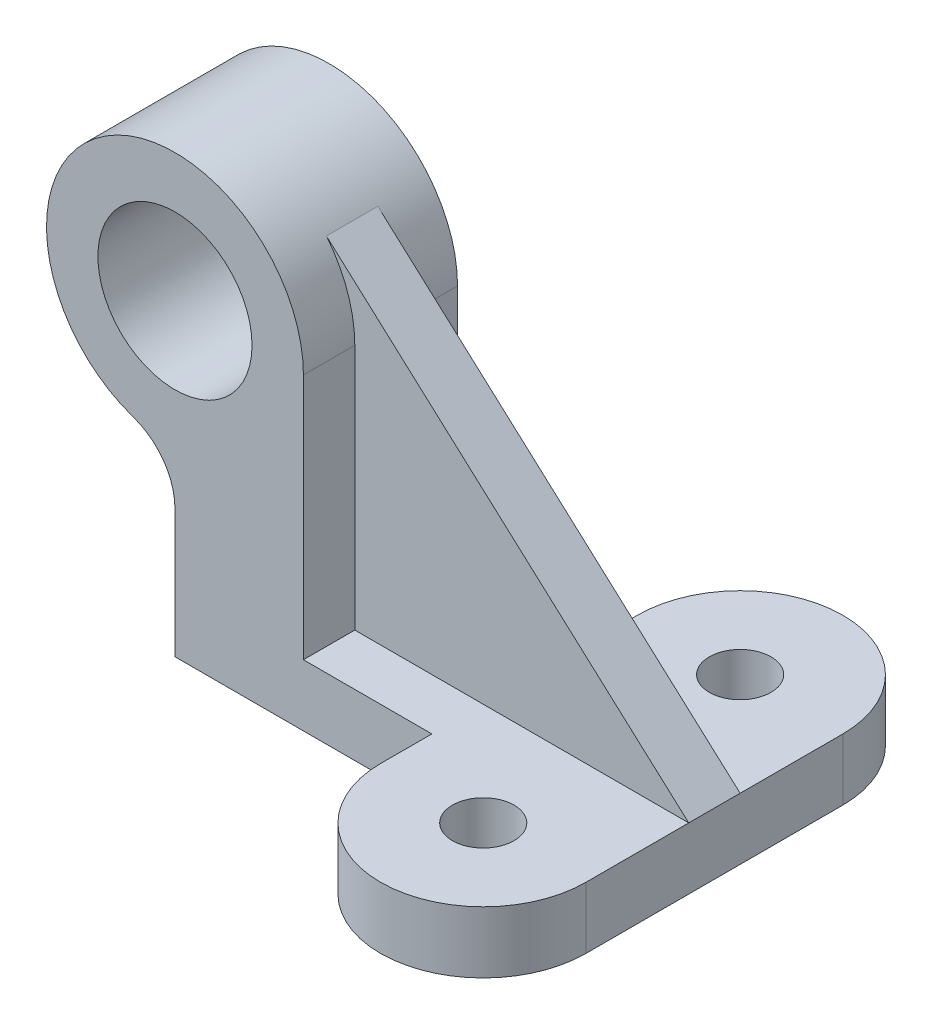
ISO-10303-21;
HEADER;
FILE_DESCRIPTION(('STEP AP214'),'2;1');
FILE_NAME('part.step','',(''),(''),'','','');
FILE_SCHEMA(('AUTOMOTIVE_DESIGN { 1 0 10303 214 1 1 1 1 }'));
ENDSEC;
DATA;
#1=APPLICATION_CONTEXT('core data for automotive mechanical design processes');
#2=APPLICATION_PROTOCOL_DEFINITION('international standard','automotive_design',2000,#1);
#3=PRODUCT_CONTEXT('',#1,'mechanical');
#4=PRODUCT('Part','Part','',(#3));
#5=PRODUCT_RELATED_PRODUCT_CATEGORY('part','',(#4));
#6=PRODUCT_DEFINITION_FORMATION('','',#4);
#7=PRODUCT_DEFINITION_CONTEXT('part definition',#1,'design');
#8=PRODUCT_DEFINITION('design','',#6,#7);
#9=PRODUCT_DEFINITION_SHAPE('','',#8);
#10=(LENGTH_UNIT() NAMED_UNIT(*) SI_UNIT(.MILLI.,.METRE.));
#11=(NAMED_UNIT(*) PLANE_ANGLE_UNIT() SI_UNIT($,.RADIAN.));
#12=(NAMED_UNIT(*) SI_UNIT($,.STERADIAN.) SOLID_ANGLE_UNIT());
#13=UNCERTAINTY_MEASURE_WITH_UNIT(LENGTH_MEASURE(1.E-05),#10,'distance_accuracy_value','');
#14=(GEOMETRIC_REPRESENTATION_CONTEXT(3) GLOBAL_UNCERTAINTY_ASSIGNED_CONTEXT((#13)) GLOBAL_UNIT_ASSIGNED_CONTEXT((#10,
#11,#12)) REPRESENTATION_CONTEXT('',''));
#15=CARTESIAN_POINT('',(0.,0.,0.));
#16=DIRECTION('',(0.,0.,1.));
#17=DIRECTION('',(1.,0.,0.));
#18=AXIS2_PLACEMENT_3D('',#15,#16,#17);
#19=CARTESIAN_POINT('',(0.,12.,25.));
#20=DIRECTION('',(0.,1.,0.));
#21=DIRECTION('',(0.,0.,1.));
#22=AXIS2_PLACEMENT_3D('',#19,#20,#21);
#23=PLANE('',#22);
#24=CARTESIAN_POINT('',(0.,12.,-25.));
#25=DIRECTION('',(0.,1.,0.));
#26=DIRECTION('',(0.,0.,1.));
#27=AXIS2_PLACEMENT_3D('',#24,#25,#26);
#28=CIRCLE('',#27,6.);
#29=CARTESIAN_POINT('',(0.,12.,-19.));
#30=VERTEX_POINT('',#29);
#31=EDGE_CURVE('E199',#30,#30,#28,.T.);
#32=ORIENTED_EDGE('',*,*,#31,.F.);
#33=EDGE_LOOP('',(#32));
#34=FACE_BOUND('',#33,.T.);
#35=DIRECTION('',(0.,0.,1.));
#36=VECTOR('',#35,1.);
#37=CARTESIAN_POINT('',(-45.,12.,-15.));
#38=LINE('',#37,#36);
#39=CARTESIAN_POINT('',(-45.,12.,-15.));
#40=VERTEX_POINT('',#39);
#41=CARTESIAN_POINT('',(-45.,12.,-5.));
#42=VERTEX_POINT('',#41);
#43=EDGE_CURVE('E169',#40,#42,#38,.T.);
#44=ORIENTED_EDGE('',*,*,#43,.T.);
#45=DIRECTION('',(1.,0.,0.));
#46=VECTOR('',#45,1.);
#47=CARTESIAN_POINT('',(0.,12.,-5.));
#48=LINE('',#47,#46);
#49=CARTESIAN_POINT('',(20.,12.,-5.));
#50=VERTEX_POINT('',#49);
#51=EDGE_CURVE('E54',#42,#50,#48,.T.);
#52=ORIENTED_EDGE('',*,*,#51,.T.);
#53=DIRECTION('',(0.,0.,-1.));
#54=VECTOR('',#53,1.);
#55=CARTESIAN_POINT('',(20.,12.,25.));
#56=LINE('',#55,#54);
#57=CARTESIAN_POINT('',(20.,12.,-25.));
#58=VERTEX_POINT('',#57);
#59=EDGE_CURVE('E166',#50,#58,#56,.T.);
#60=ORIENTED_EDGE('',*,*,#59,.T.);
#61=CARTESIAN_POINT('',(0.,12.,-25.));
#62=DIRECTION('',(0.,1.,0.));
#63=DIRECTION('',(0.,0.,1.));
#64=AXIS2_PLACEMENT_3D('',#61,#62,#63);
#65=CIRCLE('',#64,20.);
#66=CARTESIAN_POINT('',(-20.,12.,-25.));
#67=VERTEX_POINT('',#66);
#68=EDGE_CURVE('E179',#58,#67,#65,.T.);
#69=ORIENTED_EDGE('',*,*,#68,.T.);
#70=DIRECTION('',(0.,0.,1.));
#71=VECTOR('',#70,1.);
#72=CARTESIAN_POINT('',(-20.,12.,-25.));
#73=LINE('',#72,#71);
#74=CARTESIAN_POINT('',(-20.,12.,-15.));
#75=VERTEX_POINT('',#74);
#76=EDGE_CURVE('E186',#67,#75,#73,.T.);
#77=ORIENTED_EDGE('',*,*,#76,.T.);
#78=DIRECTION('',(-1.,0.,0.));
#79=VECTOR('',#78,1.);
#80=CARTESIAN_POINT('',(-20.,12.,-15.));
#81=LINE('',#80,#79);
#82=EDGE_CURVE('E188',#75,#40,#81,.T.);
#83=ORIENTED_EDGE('',*,*,#82,.T.);
#84=EDGE_LOOP('',(#44,#52,#60,#69,#77,#83));
#85=FACE_BOUND('',#84,.T.);
#86=ADVANCED_FACE('F39',(#34,#85),#23,.T.);
#87=CARTESIAN_POINT('',(-45.,0.,-15.));
#88=DIRECTION('',(1.,0.,0.));
#89=DIRECTION('',(0.,0.,-1.));
#90=AXIS2_PLACEMENT_3D('',#87,#88,#89);
#91=PLANE('',#90);
#92=DIRECTION('',(0.,0.,1.));
#93=VECTOR('',#92,1.);
#94=CARTESIAN_POINT('',(-45.,60.,-15.));
#95=LINE('',#94,#93);
#96=CARTESIAN_POINT('',(-45.,60.,-15.));
#97=VERTEX_POINT('',#96);
#98=CARTESIAN_POINT('',(-45.,60.,-5.));
#99=VERTEX_POINT('',#98);
#100=EDGE_CURVE('E285',#97,#99,#95,.T.);
#101=ORIENTED_EDGE('',*,*,#100,.T.);
#102=DIRECTION('',(0.,-1.,0.));
#103=VECTOR('',#102,1.);
#104=CARTESIAN_POINT('',(-45.,0.,-5.));
#105=LINE('',#104,#103);
#106=EDGE_CURVE('E361',#99,#42,#105,.T.);
#107=ORIENTED_EDGE('',*,*,#106,.T.);
#108=ORIENTED_EDGE('',*,*,#43,.F.);
#109=DIRECTION('',(0.,1.,0.));
#110=VECTOR('',#109,1.);
#111=CARTESIAN_POINT('',(-45.,0.,-15.));
#112=LINE('',#111,#110);
#113=EDGE_CURVE('E257',#40,#97,#112,.T.);
#114=ORIENTED_EDGE('',*,*,#113,.T.);
#115=EDGE_LOOP('',(#101,#107,#108,#114));
#116=FACE_BOUND('',#115,.T.);
#117=ADVANCED_FACE('F319',(#116),#91,.T.);
#118=DIRECTION('',(1.,0.,0.));
#119=VECTOR('',#118,1.);
#120=CARTESIAN_POINT('',(0.,12.,5.));
#121=LINE('',#120,#119);
#122=CARTESIAN_POINT('',(-45.,12.,5.));
#123=VERTEX_POINT('',#122);
#124=CARTESIAN_POINT('',(20.,12.,5.));
#125=VERTEX_POINT('',#124);
#126=EDGE_CURVE('E158',#123,#125,#121,.T.);
#127=ORIENTED_EDGE('',*,*,#126,.F.);
#128=CARTESIAN_POINT('',(-45.,12.,15.));
#129=VERTEX_POINT('',#128);
#130=EDGE_CURVE('E62',#123,#129,#38,.T.);
#131=ORIENTED_EDGE('',*,*,#130,.T.);
#132=DIRECTION('',(1.,0.,0.));
#133=VECTOR('',#132,1.);
#134=CARTESIAN_POINT('',(-70.,12.,15.));
#135=LINE('',#134,#133);
#136=CARTESIAN_POINT('',(-20.,12.,15.));
#137=VERTEX_POINT('',#136);
#138=EDGE_CURVE('E190',#129,#137,#135,.T.);
#139=ORIENTED_EDGE('',*,*,#138,.T.);
#140=DIRECTION('',(0.,0.,1.));
#141=VECTOR('',#140,1.);
#142=CARTESIAN_POINT('',(-20.,12.,25.));
#143=LINE('',#142,#141);
#144=CARTESIAN_POINT('',(-20.,12.,25.));
#145=VERTEX_POINT('',#144);
#146=EDGE_CURVE('E192',#137,#145,#143,.T.);
#147=ORIENTED_EDGE('',*,*,#146,.T.);
#148=CARTESIAN_POINT('',(0.,12.,25.));
#149=DIRECTION('',(0.,1.,0.));
#150=DIRECTION('',(0.,0.,1.));
#151=AXIS2_PLACEMENT_3D('',#148,#149,#150);
#152=CIRCLE('',#151,20.);
#153=CARTESIAN_POINT('',(20.,12.,25.));
#154=VERTEX_POINT('',#153);
#155=EDGE_CURVE('E177',#145,#154,#152,.T.);
#156=ORIENTED_EDGE('',*,*,#155,.T.);
#157=EDGE_CURVE('E176',#154,#125,#56,.T.);
#158=ORIENTED_EDGE('',*,*,#157,.T.);
#159=EDGE_LOOP('',(#127,#131,#139,#147,#156,#158));
#160=FACE_BOUND('',#159,.T.);
#161=CARTESIAN_POINT('',(0.,12.,25.));
#162=DIRECTION('',(0.,1.,0.));
#163=DIRECTION('',(0.,0.,-1.));
#164=AXIS2_PLACEMENT_3D('',#161,#162,#163);
#165=CIRCLE('',#164,5.99999999999999);
#166=CARTESIAN_POINT('',(0.,12.,19.));
#167=VERTEX_POINT('',#166);
#168=EDGE_CURVE('E290',#167,#167,#165,.T.);
#169=ORIENTED_EDGE('',*,*,#168,.F.);
#170=EDGE_LOOP('',(#169));
#171=FACE_BOUND('',#170,.T.);
#172=ADVANCED_FACE('F321',(#160,#171),#23,.T.);
#173=CARTESIAN_POINT('',(0.,0.,25.));
#174=DIRECTION('',(0.,1.,0.));
#175=DIRECTION('',(0.,0.,1.));
#176=AXIS2_PLACEMENT_3D('',#173,#174,#175);
#177=PLANE('',#176);
#178=DIRECTION('',(1.,0.,0.));
#179=VECTOR('',#178,1.);
#180=CARTESIAN_POINT('',(-70.,0.,15.));
#181=LINE('',#180,#179);
#182=CARTESIAN_POINT('',(-70.,0.,15.));
#183=VERTEX_POINT('',#182);
#184=CARTESIAN_POINT('',(-20.,0.,15.));
#185=VERTEX_POINT('',#184);
#186=EDGE_CURVE('E209',#183,#185,#181,.T.);
#187=ORIENTED_EDGE('',*,*,#186,.F.);
#188=DIRECTION('',(0.,0.,1.));
#189=VECTOR('',#188,1.);
#190=CARTESIAN_POINT('',(-70.,0.,-15.));
#191=LINE('',#190,#189);
#192=CARTESIAN_POINT('',(-70.,0.,-15.));
#193=VERTEX_POINT('',#192);
#194=EDGE_CURVE('E207',#193,#183,#191,.T.);
#195=ORIENTED_EDGE('',*,*,#194,.F.);
#196=DIRECTION('',(-1.,0.,0.));
#197=VECTOR('',#196,1.);
#198=CARTESIAN_POINT('',(-20.,0.,-15.));
#199=LINE('',#198,#197);
#200=CARTESIAN_POINT('',(-20.,0.,-15.));
#201=VERTEX_POINT('',#200);
#202=EDGE_CURVE('E205',#201,#193,#199,.T.);
#203=ORIENTED_EDGE('',*,*,#202,.F.);
#204=DIRECTION('',(0.,0.,1.));
#205=VECTOR('',#204,1.);
#206=CARTESIAN_POINT('',(-20.,0.,-25.));
#207=LINE('',#206,#205);
#208=CARTESIAN_POINT('',(-20.,0.,-25.));
#209=VERTEX_POINT('',#208);
#210=EDGE_CURVE('E203',#209,#201,#207,.T.);
#211=ORIENTED_EDGE('',*,*,#210,.F.);
#212=CARTESIAN_POINT('',(0.,0.,-25.));
#213=DIRECTION('',(0.,1.,0.));
#214=DIRECTION('',(0.,0.,1.));
#215=AXIS2_PLACEMENT_3D('',#212,#213,#214);
#216=CIRCLE('',#215,20.);
#217=CARTESIAN_POINT('',(20.,0.,-25.));
#218=VERTEX_POINT('',#217);
#219=EDGE_CURVE('E201',#218,#209,#216,.T.);
#220=ORIENTED_EDGE('',*,*,#219,.F.);
#221=DIRECTION('',(0.,0.,-1.));
#222=VECTOR('',#221,1.);
#223=CARTESIAN_POINT('',(20.,0.,25.));
#224=LINE('',#223,#222);
#225=CARTESIAN_POINT('',(20.,0.,25.));
#226=VERTEX_POINT('',#225);
#227=EDGE_CURVE('E198',#226,#218,#224,.T.);
#228=ORIENTED_EDGE('',*,*,#227,.F.);
#229=CARTESIAN_POINT('',(0.,0.,25.));
#230=DIRECTION('',(0.,1.,0.));
#231=DIRECTION('',(0.,0.,1.));
#232=AXIS2_PLACEMENT_3D('',#229,#230,#231);
#233=CIRCLE('',#232,20.);
#234=CARTESIAN_POINT('',(-20.,0.,25.));
#235=VERTEX_POINT('',#234);
#236=EDGE_CURVE('E195',#235,#226,#233,.T.);
#237=ORIENTED_EDGE('',*,*,#236,.F.);
#238=DIRECTION('',(0.,0.,1.));
#239=VECTOR('',#238,1.);
#240=CARTESIAN_POINT('',(-20.,0.,25.));
#241=LINE('',#240,#239);
#242=EDGE_CURVE('E181',#185,#235,#241,.T.);
#243=ORIENTED_EDGE('',*,*,#242,.F.);
#244=EDGE_LOOP('',(#187,#195,#203,#211,#220,#228,#237,#243));
#245=FACE_BOUND('',#244,.T.);
#246=CARTESIAN_POINT('',(0.,0.,25.));
#247=DIRECTION('',(0.,1.,0.));
#248=DIRECTION('',(0.,0.,-1.));
#249=AXIS2_PLACEMENT_3D('',#246,#247,#248);
#250=CIRCLE('',#249,5.99999999999999);
#251=CARTESIAN_POINT('',(0.,0.,19.));
#252=VERTEX_POINT('',#251);
#253=EDGE_CURVE('E284',#252,#252,#250,.T.);
#254=ORIENTED_EDGE('',*,*,#253,.T.);
#255=EDGE_LOOP('',(#254));
#256=FACE_BOUND('',#255,.T.);
#257=CARTESIAN_POINT('',(0.,0.,-25.));
#258=DIRECTION('',(0.,1.,0.));
#259=DIRECTION('',(0.,0.,1.));
#260=AXIS2_PLACEMENT_3D('',#257,#258,#259);
#261=CIRCLE('',#260,6.);
#262=CARTESIAN_POINT('',(0.,0.,-19.));
#263=VERTEX_POINT('',#262);
#264=EDGE_CURVE('E293',#263,#263,#261,.T.);
#265=ORIENTED_EDGE('',*,*,#264,.T.);
#266=EDGE_LOOP('',(#265));
#267=FACE_BOUND('',#266,.T.);
#268=ADVANCED_FACE('F238',(#245,#256,#267),#177,.F.);
#269=CARTESIAN_POINT('',(0.,12.,25.));
#270=DIRECTION('',(0.,-1.,0.));
#271=DIRECTION('',(0.,0.,-1.));
#272=AXIS2_PLACEMENT_3D('',#269,#270,#271);
#273=CYLINDRICAL_SURFACE('',#272,20.);
#274=ORIENTED_EDGE('',*,*,#236,.T.);
#275=DIRECTION('',(0.,-1.,0.));
#276=VECTOR('',#275,1.);
#277=CARTESIAN_POINT('',(20.,12.,25.));
#278=LINE('',#277,#276);
#279=EDGE_CURVE('E47',#154,#226,#278,.T.);
#280=ORIENTED_EDGE('',*,*,#279,.F.);
#281=ORIENTED_EDGE('',*,*,#155,.F.);
#282=DIRECTION('',(0.,-1.,0.));
#283=VECTOR('',#282,1.);
#284=CARTESIAN_POINT('',(-20.,12.,25.));
#285=LINE('',#284,#283);
#286=EDGE_CURVE('E194',#145,#235,#285,.T.);
#287=ORIENTED_EDGE('',*,*,#286,.T.);
#288=EDGE_LOOP('',(#274,#280,#281,#287));
#289=FACE_BOUND('',#288,.T.);
#290=ADVANCED_FACE('F41',(#289),#273,.T.);
#291=CARTESIAN_POINT('',(20.,12.,25.));
#292=DIRECTION('',(-1.,0.,0.));
#293=DIRECTION('',(0.,0.,1.));
#294=AXIS2_PLACEMENT_3D('',#291,#292,#293);
#295=PLANE('',#294);
#296=ORIENTED_EDGE('',*,*,#227,.T.);
#297=DIRECTION('',(0.,-1.,0.));
#298=VECTOR('',#297,1.);
#299=CARTESIAN_POINT('',(20.,12.,-25.));
#300=LINE('',#299,#298);
#301=EDGE_CURVE('E174',#58,#218,#300,.T.);
#302=ORIENTED_EDGE('',*,*,#301,.F.);
#303=ORIENTED_EDGE('',*,*,#59,.F.);
#304=DIRECTION('',(0.,0.,-1.));
#305=VECTOR('',#304,1.);
#306=CARTESIAN_POINT('',(20.,12.,25.));
#307=LINE('',#306,#305);
#308=EDGE_CURVE('E148',#125,#50,#307,.T.);
#309=ORIENTED_EDGE('',*,*,#308,.F.);
#310=ORIENTED_EDGE('',*,*,#157,.F.);
#311=ORIENTED_EDGE('',*,*,#279,.T.);
#312=EDGE_LOOP('',(#296,#302,#303,#309,#310,#311));
#313=FACE_BOUND('',#312,.T.);
#314=ADVANCED_FACE('F172',(#313),#295,.F.);
#315=CARTESIAN_POINT('',(0.,12.,-25.));
#316=DIRECTION('',(0.,-1.,0.));
#317=DIRECTION('',(0.,0.,-1.));
#318=AXIS2_PLACEMENT_3D('',#315,#316,#317);
#319=CYLINDRICAL_SURFACE('',#318,20.);
#320=ORIENTED_EDGE('',*,*,#219,.T.);
#321=DIRECTION('',(0.,-1.,0.));
#322=VECTOR('',#321,1.);
#323=CARTESIAN_POINT('',(-20.,12.,-25.));
#324=LINE('',#323,#322);
#325=EDGE_CURVE('E226',#67,#209,#324,.T.);
#326=ORIENTED_EDGE('',*,*,#325,.F.);
#327=ORIENTED_EDGE('',*,*,#68,.F.);
#328=ORIENTED_EDGE('',*,*,#301,.T.);
#329=EDGE_LOOP('',(#320,#326,#327,#328));
#330=FACE_BOUND('',#329,.T.);
#331=ADVANCED_FACE('F245',(#330),#319,.T.);
#332=CARTESIAN_POINT('',(-20.,12.,-25.));
#333=DIRECTION('',(1.,0.,0.));
#334=DIRECTION('',(0.,0.,-1.));
#335=AXIS2_PLACEMENT_3D('',#332,#333,#334);
#336=PLANE('',#335);
#337=ORIENTED_EDGE('',*,*,#210,.T.);
#338=DIRECTION('',(0.,-1.,0.));
#339=VECTOR('',#338,1.);
#340=CARTESIAN_POINT('',(-20.,12.,-15.));
#341=LINE('',#340,#339);
#342=EDGE_CURVE('E223',#75,#201,#341,.T.);
#343=ORIENTED_EDGE('',*,*,#342,.F.);
#344=ORIENTED_EDGE('',*,*,#76,.F.);
#345=ORIENTED_EDGE('',*,*,#325,.T.);
#346=EDGE_LOOP('',(#337,#343,#344,#345));
#347=FACE_BOUND('',#346,.T.);
#348=ADVANCED_FACE('F248',(#347),#336,.F.);
#349=CARTESIAN_POINT('',(-20.,12.,-15.));
#350=DIRECTION('',(0.,0.,1.));
#351=DIRECTION('',(1.,0.,0.));
#352=AXIS2_PLACEMENT_3D('',#349,#350,#351);
#353=PLANE('',#352);
#354=ORIENTED_EDGE('',*,*,#202,.T.);
#355=DIRECTION('',(0.,-1.,0.));
#356=VECTOR('',#355,1.);
#357=CARTESIAN_POINT('',(-70.,12.,-15.));
#358=LINE('',#357,#356);
#359=CARTESIAN_POINT('',(-70.,25.,-15.));
#360=VERTEX_POINT('',#359);
#361=EDGE_CURVE('E220',#360,#193,#358,.T.);
#362=ORIENTED_EDGE('',*,*,#361,.F.);
#363=CARTESIAN_POINT('',(-82.,25.,-15.));
#364=DIRECTION('',(0.,0.,1.));
#365=DIRECTION('',(1.,0.,0.));
#366=AXIS2_PLACEMENT_3D('',#363,#364,#365);
#367=CIRCLE('',#366,12.);
#368=CARTESIAN_POINT('',(-78.1081081081081,36.3513513513513,-15.));
#369=VERTEX_POINT('',#368);
#370=EDGE_CURVE('E262',#360,#369,#367,.T.);
#371=ORIENTED_EDGE('',*,*,#370,.T.);
#372=CARTESIAN_POINT('',(-70.,60.,-15.));
#373=DIRECTION('',(0.,0.,1.));
#374=DIRECTION('',(1.,0.,0.));
#375=AXIS2_PLACEMENT_3D('',#372,#373,#374);
#376=CIRCLE('',#375,25.);
#377=EDGE_CURVE('E259',#97,#369,#376,.T.);
#378=ORIENTED_EDGE('',*,*,#377,.F.);
#379=ORIENTED_EDGE('',*,*,#113,.F.);
#380=ORIENTED_EDGE('',*,*,#82,.F.);
#381=ORIENTED_EDGE('',*,*,#342,.T.);
#382=EDGE_LOOP('',(#354,#362,#371,#378,#379,#380,#381));
#383=FACE_BOUND('',#382,.T.);
#384=CARTESIAN_POINT('',(-70.,60.,-15.));
#385=DIRECTION('',(0.,0.,1.));
#386=DIRECTION('',(1.,0.,0.));
#387=AXIS2_PLACEMENT_3D('',#384,#385,#386);
#388=CIRCLE('',#387,15.);
#389=CARTESIAN_POINT('',(-55.,60.,-15.));
#390=VERTEX_POINT('',#389);
#391=EDGE_CURVE('E264',#390,#390,#388,.T.);
#392=ORIENTED_EDGE('',*,*,#391,.T.);
#393=EDGE_LOOP('',(#392));
#394=FACE_BOUND('',#393,.T.);
#395=ADVANCED_FACE('F253',(#383,#394),#353,.F.);
#396=CARTESIAN_POINT('',(-70.,12.,-15.));
#397=DIRECTION('',(1.,0.,0.));
#398=DIRECTION('',(0.,0.,-1.));
#399=AXIS2_PLACEMENT_3D('',#396,#397,#398);
#400=PLANE('',#399);
#401=DIRECTION('',(0.,-1.,0.));
#402=VECTOR('',#401,1.);
#403=CARTESIAN_POINT('',(-70.,12.,15.));
#404=LINE('',#403,#402);
#405=CARTESIAN_POINT('',(-70.,25.,15.));
#406=VERTEX_POINT('',#405);
#407=EDGE_CURVE('E217',#406,#183,#404,.T.);
#408=ORIENTED_EDGE('',*,*,#407,.F.);
#409=DIRECTION('',(0.,0.,1.));
#410=VECTOR('',#409,1.);
#411=CARTESIAN_POINT('',(-70.,25.,-15.));
#412=LINE('',#411,#410);
#413=EDGE_CURVE('E271',#360,#406,#412,.T.);
#414=ORIENTED_EDGE('',*,*,#413,.F.);
#415=ORIENTED_EDGE('',*,*,#361,.T.);
#416=ORIENTED_EDGE('',*,*,#194,.T.);
#417=EDGE_LOOP('',(#408,#414,#415,#416));
#418=FACE_BOUND('',#417,.T.);
#419=ADVANCED_FACE('F353',(#418),#400,.F.);
#420=CARTESIAN_POINT('',(-70.,12.,15.));
#421=DIRECTION('',(0.,0.,-1.));
#422=DIRECTION('',(-1.,0.,0.));
#423=AXIS2_PLACEMENT_3D('',#420,#421,#422);
#424=PLANE('',#423);
#425=ORIENTED_EDGE('',*,*,#186,.T.);
#426=DIRECTION('',(0.,-1.,0.));
#427=VECTOR('',#426,1.);
#428=CARTESIAN_POINT('',(-20.,12.,15.));
#429=LINE('',#428,#427);
#430=EDGE_CURVE('E214',#137,#185,#429,.T.);
#431=ORIENTED_EDGE('',*,*,#430,.F.);
#432=ORIENTED_EDGE('',*,*,#138,.F.);
#433=DIRECTION('',(0.,1.,0.));
#434=VECTOR('',#433,1.);
#435=CARTESIAN_POINT('',(-45.,0.,15.));
#436=LINE('',#435,#434);
#437=CARTESIAN_POINT('',(-45.,60.,15.));
#438=VERTEX_POINT('',#437);
#439=EDGE_CURVE('E274',#129,#438,#436,.T.);
#440=ORIENTED_EDGE('',*,*,#439,.T.);
#441=CARTESIAN_POINT('',(-70.,60.,15.));
#442=DIRECTION('',(0.,0.,1.));
#443=DIRECTION('',(1.,0.,0.));
#444=AXIS2_PLACEMENT_3D('',#441,#442,#443);
#445=CIRCLE('',#444,25.);
#446=CARTESIAN_POINT('',(-78.1081081081081,36.3513513513513,15.));
#447=VERTEX_POINT('',#446);
#448=EDGE_CURVE('E277',#438,#447,#445,.T.);
#449=ORIENTED_EDGE('',*,*,#448,.T.);
#450=CARTESIAN_POINT('',(-82.,25.,15.));
#451=DIRECTION('',(0.,0.,1.));
#452=DIRECTION('',(1.,0.,0.));
#453=AXIS2_PLACEMENT_3D('',#450,#451,#452);
#454=CIRCLE('',#453,12.);
#455=EDGE_CURVE('E157',#406,#447,#454,.T.);
#456=ORIENTED_EDGE('',*,*,#455,.F.);
#457=ORIENTED_EDGE('',*,*,#407,.T.);
#458=EDGE_LOOP('',(#425,#431,#432,#440,#449,#456,#457));
#459=FACE_BOUND('',#458,.T.);
#460=CARTESIAN_POINT('',(-70.,60.,15.));
#461=DIRECTION('',(0.,0.,1.));
#462=DIRECTION('',(1.,0.,0.));
#463=AXIS2_PLACEMENT_3D('',#460,#461,#462);
#464=CIRCLE('',#463,15.);
#465=CARTESIAN_POINT('',(-55.,60.,15.));
#466=VERTEX_POINT('',#465);
#467=EDGE_CURVE('E266',#466,#466,#464,.T.);
#468=ORIENTED_EDGE('',*,*,#467,.F.);
#469=EDGE_LOOP('',(#468));
#470=FACE_BOUND('',#469,.T.);
#471=ADVANCED_FACE('F314',(#459,#470),#424,.F.);
#472=CARTESIAN_POINT('',(-20.,12.,25.));
#473=DIRECTION('',(1.,0.,0.));
#474=DIRECTION('',(0.,0.,-1.));
#475=AXIS2_PLACEMENT_3D('',#472,#473,#474);
#476=PLANE('',#475);
#477=ORIENTED_EDGE('',*,*,#242,.T.);
#478=ORIENTED_EDGE('',*,*,#286,.F.);
#479=ORIENTED_EDGE('',*,*,#146,.F.);
#480=ORIENTED_EDGE('',*,*,#430,.T.);
#481=EDGE_LOOP('',(#477,#478,#479,#480));
#482=FACE_BOUND('',#481,.T.);
#483=ADVANCED_FACE('F304',(#482),#476,.F.);
#484=CARTESIAN_POINT('',(0.,12.,-25.));
#485=DIRECTION('',(0.,-1.,0.));
#486=DIRECTION('',(0.,0.,-1.));
#487=AXIS2_PLACEMENT_3D('',#484,#485,#486);
#488=CYLINDRICAL_SURFACE('',#487,6.);
#489=ORIENTED_EDGE('',*,*,#31,.T.);
#490=EDGE_LOOP('',(#489));
#491=FACE_BOUND('',#490,.T.);
#492=ORIENTED_EDGE('',*,*,#264,.F.);
#493=EDGE_LOOP('',(#492));
#494=FACE_BOUND('',#493,.T.);
#495=ADVANCED_FACE('F301',(#491,#494),#488,.F.);
#496=CARTESIAN_POINT('',(0.,12.,25.));
#497=DIRECTION('',(0.,-1.,0.));
#498=DIRECTION('',(0.,0.,-1.));
#499=AXIS2_PLACEMENT_3D('',#496,#497,#498);
#500=CYLINDRICAL_SURFACE('',#499,5.99999999999999);
#501=ORIENTED_EDGE('',*,*,#168,.T.);
#502=EDGE_LOOP('',(#501));
#503=FACE_BOUND('',#502,.T.);
#504=ORIENTED_EDGE('',*,*,#253,.F.);
#505=EDGE_LOOP('',(#504));
#506=FACE_BOUND('',#505,.T.);
#507=ADVANCED_FACE('F303',(#503,#506),#500,.F.);
#508=CARTESIAN_POINT('',(-82.,25.,-15.));
#509=DIRECTION('',(0.,0.,1.));
#510=DIRECTION('',(1.,0.,0.));
#511=AXIS2_PLACEMENT_3D('',#508,#509,#510);
#512=CYLINDRICAL_SURFACE('',#511,12.);
#513=ORIENTED_EDGE('',*,*,#455,.T.);
#514=DIRECTION('',(0.,0.,1.));
#515=VECTOR('',#514,1.);
#516=CARTESIAN_POINT('',(-78.1081081081081,36.3513513513513,-15.));
#517=LINE('',#516,#515);
#518=EDGE_CURVE('E282',#369,#447,#517,.T.);
#519=ORIENTED_EDGE('',*,*,#518,.F.);
#520=ORIENTED_EDGE('',*,*,#370,.F.);
#521=ORIENTED_EDGE('',*,*,#413,.T.);
#522=EDGE_LOOP('',(#513,#519,#520,#521));
#523=FACE_BOUND('',#522,.T.);
#524=ADVANCED_FACE('F311',(#523),#512,.F.);
#525=CARTESIAN_POINT('',(-70.,60.,-15.));
#526=DIRECTION('',(0.,0.,1.));
#527=DIRECTION('',(1.,0.,0.));
#528=AXIS2_PLACEMENT_3D('',#525,#526,#527);
#529=CYLINDRICAL_SURFACE('',#528,25.);
#530=CARTESIAN_POINT('',(-70.,60.,5.));
#531=DIRECTION('',(0.,0.,1.));
#532=DIRECTION('',(1.,0.,0.));
#533=AXIS2_PLACEMENT_3D('',#530,#531,#532);
#534=CIRCLE('',#533,25.);
#535=CARTESIAN_POINT('',(-50.5218738867167,75.6717134709333,5.));
#536=VERTEX_POINT('',#535);
#537=CARTESIAN_POINT('',(-45.,60.,5.));
#538=VERTEX_POINT('',#537);
#539=EDGE_CURVE('E338',#536,#538,#534,.F.);
#540=ORIENTED_EDGE('',*,*,#539,.F.);
#541=DIRECTION('',(0.,0.,1.));
#542=VECTOR('',#541,1.);
#543=CARTESIAN_POINT('',(-50.5218738867167,75.6717134709332,-15.));
#544=LINE('',#543,#542);
#545=CARTESIAN_POINT('',(-50.5218738867167,75.6717134709333,-5.));
#546=VERTEX_POINT('',#545);
#547=EDGE_CURVE('E11',#546,#536,#544,.T.);
#548=ORIENTED_EDGE('',*,*,#547,.F.);
#549=CARTESIAN_POINT('',(-70.,60.,-5.));
#550=DIRECTION('',(0.,0.,1.));
#551=DIRECTION('',(1.,0.,0.));
#552=AXIS2_PLACEMENT_3D('',#549,#550,#551);
#553=CIRCLE('',#552,25.);
#554=EDGE_CURVE('E162',#546,#99,#553,.F.);
#555=ORIENTED_EDGE('',*,*,#554,.T.);
#556=ORIENTED_EDGE('',*,*,#100,.F.);
#557=ORIENTED_EDGE('',*,*,#377,.T.);
#558=ORIENTED_EDGE('',*,*,#518,.T.);
#559=ORIENTED_EDGE('',*,*,#448,.F.);
#560=EDGE_CURVE('E287',#538,#438,#95,.T.);
#561=ORIENTED_EDGE('',*,*,#560,.F.);
#562=EDGE_LOOP('',(#540,#548,#555,#556,#557,#558,#559,#561));
#563=FACE_BOUND('',#562,.T.);
#564=ADVANCED_FACE('F360',(#563),#529,.T.);
#565=DIRECTION('',(0.,-1.,0.));
#566=VECTOR('',#565,1.);
#567=CARTESIAN_POINT('',(-45.,0.,5.));
#568=LINE('',#567,#566);
#569=EDGE_CURVE('E170',#538,#123,#568,.T.);
#570=ORIENTED_EDGE('',*,*,#569,.F.);
#571=ORIENTED_EDGE('',*,*,#560,.T.);
#572=ORIENTED_EDGE('',*,*,#439,.F.);
#573=ORIENTED_EDGE('',*,*,#130,.F.);
#574=EDGE_LOOP('',(#570,#571,#572,#573));
#575=FACE_BOUND('',#574,.T.);
#576=ADVANCED_FACE('F326',(#575),#91,.T.);
#577=CARTESIAN_POINT('',(-70.,60.,-15.));
#578=DIRECTION('',(0.,0.,1.));
#579=DIRECTION('',(1.,0.,0.));
#580=AXIS2_PLACEMENT_3D('',#577,#578,#579);
#581=CYLINDRICAL_SURFACE('',#580,15.);
#582=ORIENTED_EDGE('',*,*,#467,.T.);
#583=EDGE_LOOP('',(#582));
#584=FACE_BOUND('',#583,.T.);
#585=ORIENTED_EDGE('',*,*,#391,.F.);
#586=EDGE_LOOP('',(#585));
#587=FACE_BOUND('',#586,.T.);
#588=ADVANCED_FACE('F375',(#584,#587),#581,.F.);
#589=CARTESIAN_POINT('',(20.,12.,0.));
#590=DIRECTION('',(0.670138655476745,0.742235934481632,0.));
#591=DIRECTION('',(-0.742235934481632,0.670138655476745,0.));
#592=AXIS2_PLACEMENT_3D('',#589,#590,#591);
#593=PLANE('',#592);
#594=DIRECTION('',(-0.742235934481632,0.670138655476745,0.));
#595=VECTOR('',#594,1.);
#596=CARTESIAN_POINT('',(20.,12.,5.));
#597=LINE('',#596,#595);
#598=EDGE_CURVE('E153',#125,#536,#597,.T.);
#599=ORIENTED_EDGE('',*,*,#598,.F.);
#600=ORIENTED_EDGE('',*,*,#308,.T.);
#601=DIRECTION('',(-0.742235934481632,0.670138655476745,0.));
#602=VECTOR('',#601,1.);
#603=CARTESIAN_POINT('',(20.,12.,-5.));
#604=LINE('',#603,#602);
#605=EDGE_CURVE('E150',#50,#546,#604,.T.);
#606=ORIENTED_EDGE('',*,*,#605,.T.);
#607=ORIENTED_EDGE('',*,*,#547,.T.);
#608=EDGE_LOOP('',(#599,#600,#606,#607));
#609=FACE_BOUND('',#608,.T.);
#610=ADVANCED_FACE('F149',(#609),#593,.T.);
#611=CARTESIAN_POINT('',(-37.5,42.5,5.));
#612=DIRECTION('',(0.,0.,1.));
#613=DIRECTION('',(1.,0.,0.));
#614=AXIS2_PLACEMENT_3D('',#611,#612,#613);
#615=PLANE('',#614);
#616=ORIENTED_EDGE('',*,*,#569,.T.);
#617=ORIENTED_EDGE('',*,*,#126,.T.);
#618=ORIENTED_EDGE('',*,*,#598,.T.);
#619=ORIENTED_EDGE('',*,*,#539,.T.);
#620=EDGE_LOOP('',(#616,#617,#618,#619));
#621=FACE_BOUND('',#620,.T.);
#622=ADVANCED_FACE('F367',(#621),#615,.T.);
#623=CARTESIAN_POINT('',(-37.5,42.5,-5.));
#624=DIRECTION('',(0.,0.,1.));
#625=DIRECTION('',(1.,0.,0.));
#626=AXIS2_PLACEMENT_3D('',#623,#624,#625);
#627=PLANE('',#626);
#628=ORIENTED_EDGE('',*,*,#51,.F.);
#629=ORIENTED_EDGE('',*,*,#106,.F.);
#630=ORIENTED_EDGE('',*,*,#554,.F.);
#631=ORIENTED_EDGE('',*,*,#605,.F.);
#632=EDGE_LOOP('',(#628,#629,#630,#631));
#633=FACE_BOUND('',#632,.T.);
#634=ADVANCED_FACE('F160',(#633),#627,.F.);
#635=CLOSED_SHELL('',(#86,#117,#172,#268,#290,#314,#331,#348,#395,#419,#471,#483,#495,#507,#524,
#564,#576,#588,#610,#622,#634));
#636=MANIFOLD_SOLID_BREP('B2',#635);
#637=ADVANCED_BREP_SHAPE_REPRESENTATION('',(#18,#636),#14);
#638=SHAPE_DEFINITION_REPRESENTATION(#9,#637);
ENDSEC;
END-ISO-10303-21;
